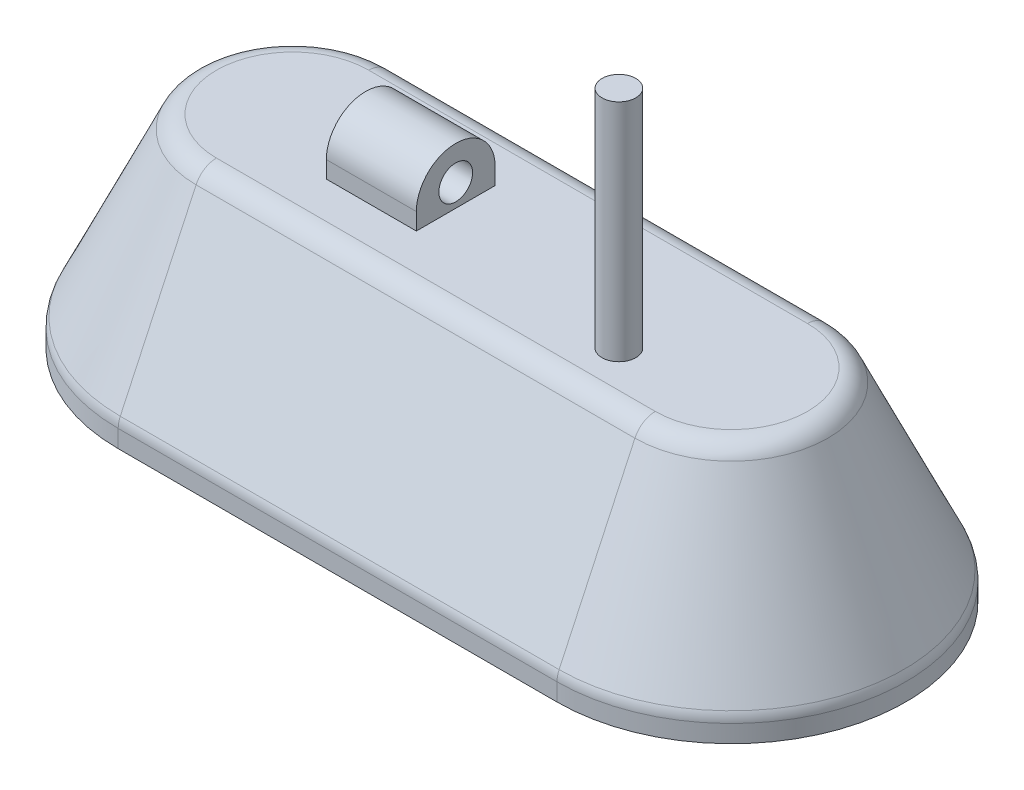
ISO-10303-21;
HEADER;
FILE_DESCRIPTION(('STEP AP214'),'2;1');
FILE_NAME('part.step','',(''),(''),'','','');
FILE_SCHEMA(('AUTOMOTIVE_DESIGN { 1 0 10303 214 1 1 1 1 }'));
ENDSEC;
DATA;
#1=APPLICATION_CONTEXT('core data for automotive mechanical design processes');
#2=APPLICATION_PROTOCOL_DEFINITION('international standard','automotive_design',2000,#1);
#3=PRODUCT_CONTEXT('',#1,'mechanical');
#4=PRODUCT('Part','Part','',(#3));
#5=PRODUCT_RELATED_PRODUCT_CATEGORY('part','',(#4));
#6=PRODUCT_DEFINITION_FORMATION('','',#4);
#7=PRODUCT_DEFINITION_CONTEXT('part definition',#1,'design');
#8=PRODUCT_DEFINITION('design','',#6,#7);
#9=PRODUCT_DEFINITION_SHAPE('','',#8);
#10=(LENGTH_UNIT() NAMED_UNIT(*) SI_UNIT(.MILLI.,.METRE.));
#11=(NAMED_UNIT(*) PLANE_ANGLE_UNIT() SI_UNIT($,.RADIAN.));
#12=(NAMED_UNIT(*) SI_UNIT($,.STERADIAN.) SOLID_ANGLE_UNIT());
#13=UNCERTAINTY_MEASURE_WITH_UNIT(LENGTH_MEASURE(1.E-05),#10,'distance_accuracy_value','');
#14=(GEOMETRIC_REPRESENTATION_CONTEXT(3) GLOBAL_UNCERTAINTY_ASSIGNED_CONTEXT((#13)) GLOBAL_UNIT_ASSIGNED_CONTEXT((#10,
#11,#12)) REPRESENTATION_CONTEXT('',''));
#15=CARTESIAN_POINT('',(0.,0.,0.));
#16=DIRECTION('',(0.,0.,1.));
#17=DIRECTION('',(1.,0.,0.));
#18=AXIS2_PLACEMENT_3D('',#15,#16,#17);
#19=CARTESIAN_POINT('',(-32.5,23.,-12.));
#20=DIRECTION('',(0.,0.,-1.));
#21=DIRECTION('',(-1.,0.,0.));
#22=AXIS2_PLACEMENT_3D('',#19,#20,#21);
#23=PLANE('',#22);
#24=DIRECTION('',(-1.,0.,0.));
#25=VECTOR('',#24,1.);
#26=CARTESIAN_POINT('',(-22.5,19.5,-12.));
#27=LINE('',#26,#25);
#28=CARTESIAN_POINT('',(-24.5,19.5,-12.));
#29=VERTEX_POINT('',#28);
#30=CARTESIAN_POINT('',(-32.5,19.5,-12.));
#31=VERTEX_POINT('',#30);
#32=EDGE_CURVE('E153',#29,#31,#27,.T.);
#33=ORIENTED_EDGE('',*,*,#32,.T.);
#34=DIRECTION('',(0.,-1.,0.));
#35=VECTOR('',#34,1.);
#36=CARTESIAN_POINT('',(-32.5,23.,-12.));
#37=LINE('',#36,#35);
#38=CARTESIAN_POINT('',(-32.5,18.,-12.));
#39=VERTEX_POINT('',#38);
#40=EDGE_CURVE('E165',#31,#39,#37,.T.);
#41=ORIENTED_EDGE('',*,*,#40,.T.);
#42=DIRECTION('',(1.,0.,0.));
#43=VECTOR('',#42,1.);
#44=CARTESIAN_POINT('',(-32.5,18.,-12.));
#45=LINE('',#44,#43);
#46=CARTESIAN_POINT('',(-24.5,18.,-12.));
#47=VERTEX_POINT('',#46);
#48=EDGE_CURVE('E606',#39,#47,#45,.T.);
#49=ORIENTED_EDGE('',*,*,#48,.T.);
#50=DIRECTION('',(0.,-1.,0.));
#51=VECTOR('',#50,1.);
#52=CARTESIAN_POINT('',(-24.5,23.,-12.));
#53=LINE('',#52,#51);
#54=EDGE_CURVE('E167',#29,#47,#53,.T.);
#55=ORIENTED_EDGE('',*,*,#54,.F.);
#56=EDGE_LOOP('',(#33,#41,#49,#55));
#57=FACE_BOUND('',#56,.T.);
#58=ADVANCED_FACE('F47',(#57),#23,.F.);
#59=CARTESIAN_POINT('',(0.,18.,-15.5));
#60=DIRECTION('',(0.,-1.,0.));
#61=DIRECTION('',(0.,0.,-1.));
#62=AXIS2_PLACEMENT_3D('',#59,#60,#61);
#63=PLANE('',#62);
#64=DIRECTION('',(-1.,0.,0.));
#65=VECTOR('',#64,1.);
#66=CARTESIAN_POINT('',(0.,18.,-8.73506305209498));
#67=LINE('',#66,#65);
#68=CARTESIAN_POINT('',(-39.,18.,-8.73506305209498));
#69=VERTEX_POINT('',#68);
#70=CARTESIAN_POINT('',(0.,18.,-8.73506305209498));
#71=VERTEX_POINT('',#70);
#72=EDGE_CURVE('E65',#69,#71,#67,.F.);
#73=ORIENTED_EDGE('',*,*,#72,.T.);
#74=CARTESIAN_POINT('',(0.,18.,-15.5));
#75=DIRECTION('',(0.,-1.,0.));
#76=DIRECTION('',(0.,0.,-1.));
#77=AXIS2_PLACEMENT_3D('',#74,#75,#76);
#78=CIRCLE('',#77,6.76493694790502);
#79=CARTESIAN_POINT('',(0.,18.,-22.264936947905));
#80=VERTEX_POINT('',#79);
#81=EDGE_CURVE('E276',#71,#80,#78,.F.);
#82=ORIENTED_EDGE('',*,*,#81,.T.);
#83=DIRECTION('',(1.,0.,0.));
#84=VECTOR('',#83,1.);
#85=CARTESIAN_POINT('',(-39.,18.,-22.264936947905));
#86=LINE('',#85,#84);
#87=CARTESIAN_POINT('',(-39.,18.,-22.264936947905));
#88=VERTEX_POINT('',#87);
#89=EDGE_CURVE('E269',#80,#88,#86,.F.);
#90=ORIENTED_EDGE('',*,*,#89,.T.);
#91=CARTESIAN_POINT('',(-39.,18.,-15.5));
#92=DIRECTION('',(0.,-1.,0.));
#93=DIRECTION('',(0.,0.,-1.));
#94=AXIS2_PLACEMENT_3D('',#91,#92,#93);
#95=CIRCLE('',#94,6.76493694790502);
#96=EDGE_CURVE('E70',#88,#69,#95,.F.);
#97=ORIENTED_EDGE('',*,*,#96,.T.);
#98=EDGE_LOOP('',(#73,#82,#90,#97));
#99=FACE_BOUND('',#98,.T.);
#100=CARTESIAN_POINT('',(-6.5,18.,-12.));
#101=DIRECTION('',(0.,-1.,0.));
#102=DIRECTION('',(0.,0.,-1.));
#103=AXIS2_PLACEMENT_3D('',#100,#101,#102);
#104=CIRCLE('',#103,1.5);
#105=CARTESIAN_POINT('',(-6.5,18.,-13.5));
#106=VERTEX_POINT('',#105);
#107=EDGE_CURVE('E213',#106,#106,#104,.F.);
#108=ORIENTED_EDGE('',*,*,#107,.F.);
#109=EDGE_LOOP('',(#108));
#110=FACE_BOUND('',#109,.T.);
#111=DIRECTION('',(0.,0.,1.));
#112=VECTOR('',#111,1.);
#113=CARTESIAN_POINT('',(-32.5,18.,-19.));
#114=LINE('',#113,#112);
#115=CARTESIAN_POINT('',(-32.5,18.,-19.));
#116=VERTEX_POINT('',#115);
#117=EDGE_CURVE('E173',#116,#39,#114,.T.);
#118=ORIENTED_EDGE('',*,*,#117,.F.);
#119=DIRECTION('',(-1.,0.,0.));
#120=VECTOR('',#119,1.);
#121=CARTESIAN_POINT('',(-24.5,18.,-19.));
#122=LINE('',#121,#120);
#123=CARTESIAN_POINT('',(-24.5,18.,-19.));
#124=VERTEX_POINT('',#123);
#125=EDGE_CURVE('E599',#124,#116,#122,.T.);
#126=ORIENTED_EDGE('',*,*,#125,.F.);
#127=DIRECTION('',(0.,0.,-1.));
#128=VECTOR('',#127,1.);
#129=CARTESIAN_POINT('',(-24.5,18.,-12.));
#130=LINE('',#129,#128);
#131=EDGE_CURVE('E593',#47,#124,#130,.T.);
#132=ORIENTED_EDGE('',*,*,#131,.F.);
#133=ORIENTED_EDGE('',*,*,#48,.F.);
#134=EDGE_LOOP('',(#118,#126,#132,#133));
#135=FACE_BOUND('',#134,.T.);
#136=ADVANCED_FACE('F374',(#99,#110,#135),#63,.F.);
#137=CARTESIAN_POINT('',(0.,18.,-15.5));
#138=DIRECTION('',(0.,-1.,0.));
#139=DIRECTION('',(0.,0.,-1.));
#140=AXIS2_PLACEMENT_3D('',#137,#138,#139);
#141=CYLINDRICAL_SURFACE('',#140,15.5);
#142=DIRECTION('',(0.,-1.,0.));
#143=VECTOR('',#142,1.);
#144=CARTESIAN_POINT('',(0.,18.,-31.));
#145=LINE('',#144,#143);
#146=CARTESIAN_POINT('',(0.,1.55661067471401,-31.));
#147=VERTEX_POINT('',#146);
#148=CARTESIAN_POINT('',(0.,0.,-31.));
#149=VERTEX_POINT('',#148);
#150=EDGE_CURVE('E210',#147,#149,#145,.T.);
#151=ORIENTED_EDGE('',*,*,#150,.F.);
#152=CARTESIAN_POINT('',(0.,1.55661067471401,-15.5));
#153=DIRECTION('',(0.,1.,0.));
#154=DIRECTION('',(0.,0.,1.));
#155=AXIS2_PLACEMENT_3D('',#152,#153,#154);
#156=CIRCLE('',#155,15.5);
#157=CARTESIAN_POINT('',(0.,1.55661067471401,0.));
#158=VERTEX_POINT('',#157);
#159=EDGE_CURVE('E259',#147,#158,#156,.F.);
#160=ORIENTED_EDGE('',*,*,#159,.T.);
#161=DIRECTION('',(0.,-1.,0.));
#162=VECTOR('',#161,1.);
#163=CARTESIAN_POINT('',(0.,18.,0.));
#164=LINE('',#163,#162);
#165=CARTESIAN_POINT('',(0.,0.,0.));
#166=VERTEX_POINT('',#165);
#167=EDGE_CURVE('E201',#158,#166,#164,.T.);
#168=ORIENTED_EDGE('',*,*,#167,.T.);
#169=CARTESIAN_POINT('',(0.,0.,-15.5));
#170=DIRECTION('',(0.,1.,0.));
#171=DIRECTION('',(0.,0.,-1.));
#172=AXIS2_PLACEMENT_3D('',#169,#170,#171);
#173=CIRCLE('',#172,15.5);
#174=EDGE_CURVE('E180',#166,#149,#173,.T.);
#175=ORIENTED_EDGE('',*,*,#174,.T.);
#176=EDGE_LOOP('',(#151,#160,#168,#175));
#177=FACE_BOUND('',#176,.T.);
#178=ADVANCED_FACE('F364',(#177),#141,.T.);
#179=CARTESIAN_POINT('',(-39.,18.,-31.));
#180=DIRECTION('',(0.,0.,1.));
#181=DIRECTION('',(1.,0.,0.));
#182=AXIS2_PLACEMENT_3D('',#179,#180,#181);
#183=PLANE('',#182);
#184=DIRECTION('',(0.,-1.,0.));
#185=VECTOR('',#184,1.);
#186=CARTESIAN_POINT('',(-39.,18.,-31.));
#187=LINE('',#186,#185);
#188=CARTESIAN_POINT('',(-39.,1.55661067471401,-31.));
#189=VERTEX_POINT('',#188);
#190=CARTESIAN_POINT('',(-39.,0.,-31.));
#191=VERTEX_POINT('',#190);
#192=EDGE_CURVE('E207',#189,#191,#187,.T.);
#193=ORIENTED_EDGE('',*,*,#192,.F.);
#194=DIRECTION('',(-1.,0.,0.));
#195=VECTOR('',#194,1.);
#196=CARTESIAN_POINT('',(0.,1.55661067471401,-31.));
#197=LINE('',#196,#195);
#198=EDGE_CURVE('E279',#189,#147,#197,.F.);
#199=ORIENTED_EDGE('',*,*,#198,.T.);
#200=ORIENTED_EDGE('',*,*,#150,.T.);
#201=DIRECTION('',(-1.,0.,0.));
#202=VECTOR('',#201,1.);
#203=CARTESIAN_POINT('',(-39.,0.,-31.));
#204=LINE('',#203,#202);
#205=EDGE_CURVE('E189',#149,#191,#204,.T.);
#206=ORIENTED_EDGE('',*,*,#205,.T.);
#207=EDGE_LOOP('',(#193,#199,#200,#206));
#208=FACE_BOUND('',#207,.T.);
#209=ADVANCED_FACE('F366',(#208),#183,.F.);
#210=CARTESIAN_POINT('',(-39.,18.,-15.5));
#211=DIRECTION('',(0.,-1.,0.));
#212=DIRECTION('',(0.,0.,-1.));
#213=AXIS2_PLACEMENT_3D('',#210,#211,#212);
#214=CYLINDRICAL_SURFACE('',#213,15.5);
#215=DIRECTION('',(0.,-1.,0.));
#216=VECTOR('',#215,1.);
#217=CARTESIAN_POINT('',(-39.,18.,0.));
#218=LINE('',#217,#216);
#219=CARTESIAN_POINT('',(-39.,1.55661067471401,0.));
#220=VERTEX_POINT('',#219);
#221=CARTESIAN_POINT('',(-39.,0.,0.));
#222=VERTEX_POINT('',#221);
#223=EDGE_CURVE('E204',#220,#222,#218,.T.);
#224=ORIENTED_EDGE('',*,*,#223,.F.);
#225=CARTESIAN_POINT('',(-39.,1.55661067471401,-15.5));
#226=DIRECTION('',(0.,1.,0.));
#227=DIRECTION('',(0.,0.,1.));
#228=AXIS2_PLACEMENT_3D('',#225,#226,#227);
#229=CIRCLE('',#228,15.5);
#230=EDGE_CURVE('E217',#220,#189,#229,.F.);
#231=ORIENTED_EDGE('',*,*,#230,.T.);
#232=ORIENTED_EDGE('',*,*,#192,.T.);
#233=CARTESIAN_POINT('',(-39.,0.,-15.5));
#234=DIRECTION('',(0.,1.,0.));
#235=DIRECTION('',(0.,0.,1.));
#236=AXIS2_PLACEMENT_3D('',#233,#234,#235);
#237=CIRCLE('',#236,15.5);
#238=EDGE_CURVE('E193',#191,#222,#237,.T.);
#239=ORIENTED_EDGE('',*,*,#238,.T.);
#240=EDGE_LOOP('',(#224,#231,#232,#239));
#241=FACE_BOUND('',#240,.T.);
#242=ADVANCED_FACE('F354',(#241),#214,.T.);
#243=CARTESIAN_POINT('',(0.,18.,0.));
#244=DIRECTION('',(0.,0.,-1.));
#245=DIRECTION('',(-1.,0.,0.));
#246=AXIS2_PLACEMENT_3D('',#243,#244,#245);
#247=PLANE('',#246);
#248=ORIENTED_EDGE('',*,*,#167,.F.);
#249=DIRECTION('',(1.,0.,0.));
#250=VECTOR('',#249,1.);
#251=CARTESIAN_POINT('',(-39.,1.55661067471401,0.));
#252=LINE('',#251,#250);
#253=EDGE_CURVE('E250',#158,#220,#252,.F.);
#254=ORIENTED_EDGE('',*,*,#253,.T.);
#255=ORIENTED_EDGE('',*,*,#223,.T.);
#256=DIRECTION('',(1.,0.,0.));
#257=VECTOR('',#256,1.);
#258=CARTESIAN_POINT('',(0.,0.,0.));
#259=LINE('',#258,#257);
#260=EDGE_CURVE('E197',#222,#166,#259,.T.);
#261=ORIENTED_EDGE('',*,*,#260,.T.);
#262=EDGE_LOOP('',(#248,#254,#255,#261));
#263=FACE_BOUND('',#262,.T.);
#264=ADVANCED_FACE('F352',(#263),#247,.F.);
#265=CARTESIAN_POINT('',(0.,0.,-15.5));
#266=DIRECTION('',(0.,-1.,0.));
#267=DIRECTION('',(0.,0.,-1.));
#268=AXIS2_PLACEMENT_3D('',#265,#266,#267);
#269=PLANE('',#268);
#270=ORIENTED_EDGE('',*,*,#174,.F.);
#271=ORIENTED_EDGE('',*,*,#260,.F.);
#272=ORIENTED_EDGE('',*,*,#238,.F.);
#273=ORIENTED_EDGE('',*,*,#205,.F.);
#274=EDGE_LOOP('',(#270,#271,#272,#273));
#275=FACE_BOUND('',#274,.T.);
#276=ADVANCED_FACE('F361',(#275),#269,.T.);
#277=CARTESIAN_POINT('',(-6.5,38.,-12.));
#278=DIRECTION('',(0.,-1.,0.));
#279=DIRECTION('',(0.,0.,-1.));
#280=AXIS2_PLACEMENT_3D('',#277,#278,#279);
#281=CYLINDRICAL_SURFACE('',#280,1.5);
#282=CARTESIAN_POINT('',(-6.5,38.,-12.));
#283=DIRECTION('',(0.,1.,0.));
#284=DIRECTION('',(0.,0.,1.));
#285=AXIS2_PLACEMENT_3D('',#282,#283,#284);
#286=CIRCLE('',#285,1.5);
#287=CARTESIAN_POINT('',(-6.5,38.,-10.5));
#288=VERTEX_POINT('',#287);
#289=EDGE_CURVE('E175',#288,#288,#286,.T.);
#290=ORIENTED_EDGE('',*,*,#289,.F.);
#291=EDGE_LOOP('',(#290));
#292=FACE_BOUND('',#291,.T.);
#293=ORIENTED_EDGE('',*,*,#107,.T.);
#294=EDGE_LOOP('',(#293));
#295=FACE_BOUND('',#294,.T.);
#296=ADVANCED_FACE('F392',(#292,#295),#281,.T.);
#297=CARTESIAN_POINT('',(-6.5,38.,-12.));
#298=DIRECTION('',(0.,1.,0.));
#299=DIRECTION('',(0.,0.,1.));
#300=AXIS2_PLACEMENT_3D('',#297,#298,#299);
#301=PLANE('',#300);
#302=ORIENTED_EDGE('',*,*,#289,.T.);
#303=EDGE_LOOP('',(#302));
#304=FACE_BOUND('',#303,.T.);
#305=ADVANCED_FACE('F389',(#304),#301,.T.);
#306=CARTESIAN_POINT('',(-32.5,23.,-19.));
#307=DIRECTION('',(1.,0.,0.));
#308=DIRECTION('',(0.,0.,-1.));
#309=AXIS2_PLACEMENT_3D('',#306,#307,#308);
#310=PLANE('',#309);
#311=CARTESIAN_POINT('',(-32.5,20.,-15.5));
#312=DIRECTION('',(-1.,0.,0.));
#313=DIRECTION('',(0.,0.,1.));
#314=AXIS2_PLACEMENT_3D('',#311,#312,#313);
#315=CIRCLE('',#314,1.5);
#316=CARTESIAN_POINT('',(-32.5,20.,-14.));
#317=VERTEX_POINT('',#316);
#318=EDGE_CURVE('E161',#317,#317,#315,.T.);
#319=ORIENTED_EDGE('',*,*,#318,.F.);
#320=EDGE_LOOP('',(#319));
#321=FACE_BOUND('',#320,.T.);
#322=ORIENTED_EDGE('',*,*,#40,.F.);
#323=CARTESIAN_POINT('',(-32.5,19.5,-15.5));
#324=DIRECTION('',(1.,0.,0.));
#325=DIRECTION('',(0.,0.,-1.));
#326=AXIS2_PLACEMENT_3D('',#323,#324,#325);
#327=CIRCLE('',#326,3.50000000000001);
#328=CARTESIAN_POINT('',(-32.5,19.5,-19.));
#329=VERTEX_POINT('',#328);
#330=EDGE_CURVE('E150',#329,#31,#327,.T.);
#331=ORIENTED_EDGE('',*,*,#330,.F.);
#332=DIRECTION('',(0.,-1.,0.));
#333=VECTOR('',#332,1.);
#334=CARTESIAN_POINT('',(-32.5,23.,-19.));
#335=LINE('',#334,#333);
#336=EDGE_CURVE('E597',#329,#116,#335,.T.);
#337=ORIENTED_EDGE('',*,*,#336,.T.);
#338=ORIENTED_EDGE('',*,*,#117,.T.);
#339=EDGE_LOOP('',(#322,#331,#337,#338));
#340=FACE_BOUND('',#339,.T.);
#341=ADVANCED_FACE('F171',(#321,#340),#310,.F.);
#342=CARTESIAN_POINT('',(-24.5,23.,-12.));
#343=DIRECTION('',(-1.,0.,0.));
#344=DIRECTION('',(0.,0.,1.));
#345=AXIS2_PLACEMENT_3D('',#342,#343,#344);
#346=PLANE('',#345);
#347=CARTESIAN_POINT('',(-24.5,20.,-15.5));
#348=DIRECTION('',(-1.,0.,0.));
#349=DIRECTION('',(0.,0.,1.));
#350=AXIS2_PLACEMENT_3D('',#347,#348,#349);
#351=CIRCLE('',#350,1.5);
#352=CARTESIAN_POINT('',(-24.5,20.,-14.));
#353=VERTEX_POINT('',#352);
#354=EDGE_CURVE('E218',#353,#353,#351,.T.);
#355=ORIENTED_EDGE('',*,*,#354,.T.);
#356=EDGE_LOOP('',(#355));
#357=FACE_BOUND('',#356,.T.);
#358=DIRECTION('',(0.,-1.,0.));
#359=VECTOR('',#358,1.);
#360=CARTESIAN_POINT('',(-24.5,23.,-19.));
#361=LINE('',#360,#359);
#362=CARTESIAN_POINT('',(-24.5,19.5,-19.));
#363=VERTEX_POINT('',#362);
#364=EDGE_CURVE('E182',#363,#124,#361,.T.);
#365=ORIENTED_EDGE('',*,*,#364,.F.);
#366=CARTESIAN_POINT('',(-24.5,19.5,-15.5));
#367=DIRECTION('',(-1.,0.,0.));
#368=DIRECTION('',(0.,0.,1.));
#369=AXIS2_PLACEMENT_3D('',#366,#367,#368);
#370=CIRCLE('',#369,3.50000000000001);
#371=EDGE_CURVE('E222',#363,#29,#370,.F.);
#372=ORIENTED_EDGE('',*,*,#371,.T.);
#373=ORIENTED_EDGE('',*,*,#54,.T.);
#374=ORIENTED_EDGE('',*,*,#131,.T.);
#375=EDGE_LOOP('',(#365,#372,#373,#374));
#376=FACE_BOUND('',#375,.T.);
#377=ADVANCED_FACE('F386',(#357,#376),#346,.F.);
#378=CARTESIAN_POINT('',(-24.5,23.,-19.));
#379=DIRECTION('',(0.,0.,1.));
#380=DIRECTION('',(1.,0.,0.));
#381=AXIS2_PLACEMENT_3D('',#378,#379,#380);
#382=PLANE('',#381);
#383=ORIENTED_EDGE('',*,*,#336,.F.);
#384=DIRECTION('',(-1.,0.,0.));
#385=VECTOR('',#384,1.);
#386=CARTESIAN_POINT('',(-22.5,19.5,-19.));
#387=LINE('',#386,#385);
#388=EDGE_CURVE('E156',#363,#329,#387,.T.);
#389=ORIENTED_EDGE('',*,*,#388,.F.);
#390=ORIENTED_EDGE('',*,*,#364,.T.);
#391=ORIENTED_EDGE('',*,*,#125,.T.);
#392=EDGE_LOOP('',(#383,#389,#390,#391));
#393=FACE_BOUND('',#392,.T.);
#394=ADVANCED_FACE('F518',(#393),#382,.F.);
#395=CARTESIAN_POINT('',(-22.5,19.5,-15.5));
#396=DIRECTION('',(-1.,0.,0.));
#397=DIRECTION('',(0.,0.,1.));
#398=AXIS2_PLACEMENT_3D('',#395,#396,#397);
#399=CYLINDRICAL_SURFACE('',#398,3.50000000000001);
#400=ORIENTED_EDGE('',*,*,#388,.T.);
#401=ORIENTED_EDGE('',*,*,#330,.T.);
#402=ORIENTED_EDGE('',*,*,#32,.F.);
#403=ORIENTED_EDGE('',*,*,#371,.F.);
#404=EDGE_LOOP('',(#400,#401,#402,#403));
#405=FACE_BOUND('',#404,.T.);
#406=ADVANCED_FACE('F152',(#405),#399,.T.);
#407=CARTESIAN_POINT('',(-22.5,20.,-15.5));
#408=DIRECTION('',(-1.,0.,0.));
#409=DIRECTION('',(0.,0.,1.));
#410=AXIS2_PLACEMENT_3D('',#407,#408,#409);
#411=CYLINDRICAL_SURFACE('',#410,1.5);
#412=ORIENTED_EDGE('',*,*,#318,.T.);
#413=EDGE_LOOP('',(#412));
#414=FACE_BOUND('',#413,.T.);
#415=ORIENTED_EDGE('',*,*,#354,.F.);
#416=EDGE_LOOP('',(#415));
#417=FACE_BOUND('',#416,.T.);
#418=ADVANCED_FACE('F412',(#414,#417),#411,.F.);
#419=CARTESIAN_POINT('',(0.,18.,-23.53907746952));
#420=DIRECTION('',(0.,-0.422618261740697,0.906307787036651));
#421=DIRECTION('',(-1.,0.,0.));
#422=AXIS2_PLACEMENT_3D('',#419,#420,#421);
#423=PLANE('',#422);
#424=DIRECTION('',(0.,0.906307787036651,0.422618261740697));
#425=VECTOR('',#424,1.);
#426=CARTESIAN_POINT('',(0.,1.99999999999989,-31.));
#427=LINE('',#426,#425);
#428=CARTESIAN_POINT('',(0.,2.40184719819541,-30.8126155740733));
#429=VERTEX_POINT('',#428);
#430=CARTESIAN_POINT('',(0.,16.8452365234814,-24.0775525219783));
#431=VERTEX_POINT('',#430);
#432=EDGE_CURVE('E232',#429,#431,#427,.T.);
#433=ORIENTED_EDGE('',*,*,#432,.F.);
#434=DIRECTION('',(1.,0.,0.));
#435=VECTOR('',#434,1.);
#436=CARTESIAN_POINT('',(-39.,2.40184719819541,-30.8126155740733));
#437=LINE('',#436,#435);
#438=CARTESIAN_POINT('',(-39.,2.40184719819541,-30.8126155740733));
#439=VERTEX_POINT('',#438);
#440=EDGE_CURVE('E11',#429,#439,#437,.F.);
#441=ORIENTED_EDGE('',*,*,#440,.T.);
#442=DIRECTION('',(0.,-0.906307787036651,-0.422618261740697));
#443=VECTOR('',#442,1.);
#444=CARTESIAN_POINT('',(-39.,18.,-23.53907746952));
#445=LINE('',#444,#443);
#446=CARTESIAN_POINT('',(-39.,16.8452365234814,-24.0775525219783));
#447=VERTEX_POINT('',#446);
#448=EDGE_CURVE('E236',#447,#439,#445,.T.);
#449=ORIENTED_EDGE('',*,*,#448,.F.);
#450=DIRECTION('',(-1.,0.,0.));
#451=VECTOR('',#450,1.);
#452=CARTESIAN_POINT('',(0.,16.8452365234814,-24.0775525219783));
#453=LINE('',#452,#451);
#454=EDGE_CURVE('E57',#447,#431,#453,.F.);
#455=ORIENTED_EDGE('',*,*,#454,.T.);
#456=EDGE_LOOP('',(#433,#441,#449,#455));
#457=FACE_BOUND('',#456,.T.);
#458=ADVANCED_FACE('F323',(#457),#423,.F.);
#459=CARTESIAN_POINT('',(-39.,18.,-15.5));
#460=DIRECTION('',(0.,-1.,0.));
#461=DIRECTION('',(0.,0.,-1.));
#462=AXIS2_PLACEMENT_3D('',#459,#460,#461);
#463=CONICAL_SURFACE('',#462,8.03907746952001,0.43633231299858);
#464=ORIENTED_EDGE('',*,*,#448,.T.);
#465=CARTESIAN_POINT('',(-39.,2.40184719819541,-15.5));
#466=DIRECTION('',(0.,-1.,0.));
#467=DIRECTION('',(0.,0.,-1.));
#468=AXIS2_PLACEMENT_3D('',#465,#466,#467);
#469=CIRCLE('',#468,15.3126155740733);
#470=CARTESIAN_POINT('',(-39.,2.40184719819541,-0.187384425926702));
#471=VERTEX_POINT('',#470);
#472=EDGE_CURVE('E246',#439,#471,#469,.F.);
#473=ORIENTED_EDGE('',*,*,#472,.T.);
#474=DIRECTION('',(0.,-0.906307787036651,0.422618261740697));
#475=VECTOR('',#474,1.);
#476=CARTESIAN_POINT('',(-39.,18.,-7.46092253047999));
#477=LINE('',#476,#475);
#478=CARTESIAN_POINT('',(-39.,16.8452365234814,-6.92244747802168));
#479=VERTEX_POINT('',#478);
#480=EDGE_CURVE('E227',#479,#471,#477,.T.);
#481=ORIENTED_EDGE('',*,*,#480,.F.);
#482=CARTESIAN_POINT('',(-39.,16.8452365234814,-15.5));
#483=DIRECTION('',(0.,-1.,0.));
#484=DIRECTION('',(0.,0.,-1.));
#485=AXIS2_PLACEMENT_3D('',#482,#483,#484);
#486=CIRCLE('',#485,8.57755252197832);
#487=EDGE_CURVE('E243',#479,#447,#486,.T.);
#488=ORIENTED_EDGE('',*,*,#487,.T.);
#489=EDGE_LOOP('',(#464,#473,#481,#488));
#490=FACE_BOUND('',#489,.T.);
#491=ADVANCED_FACE('F319',(#490),#463,.T.);
#492=CARTESIAN_POINT('',(0.,18.,-15.5));
#493=DIRECTION('',(0.,-1.,0.));
#494=DIRECTION('',(0.,0.,-1.));
#495=AXIS2_PLACEMENT_3D('',#492,#493,#494);
#496=CONICAL_SURFACE('',#495,8.03907746952001,0.43633231299858);
#497=DIRECTION('',(0.,0.906307787036651,-0.422618261740697));
#498=VECTOR('',#497,1.);
#499=CARTESIAN_POINT('',(0.,1.99999999999989,0.));
#500=LINE('',#499,#498);
#501=CARTESIAN_POINT('',(0.,2.40184719819541,-0.187384425926699));
#502=VERTEX_POINT('',#501);
#503=CARTESIAN_POINT('',(0.,16.8452365234814,-6.92244747802168));
#504=VERTEX_POINT('',#503);
#505=EDGE_CURVE('E223',#502,#504,#500,.T.);
#506=ORIENTED_EDGE('',*,*,#505,.F.);
#507=CARTESIAN_POINT('',(0.,2.40184719819541,-15.5));
#508=DIRECTION('',(0.,-1.,0.));
#509=DIRECTION('',(0.,0.,-1.));
#510=AXIS2_PLACEMENT_3D('',#507,#508,#509);
#511=CIRCLE('',#510,15.3126155740733);
#512=EDGE_CURVE('E266',#502,#429,#511,.F.);
#513=ORIENTED_EDGE('',*,*,#512,.T.);
#514=ORIENTED_EDGE('',*,*,#432,.T.);
#515=CARTESIAN_POINT('',(0.,16.8452365234814,-15.5));
#516=DIRECTION('',(0.,-1.,0.));
#517=DIRECTION('',(0.,0.,-1.));
#518=AXIS2_PLACEMENT_3D('',#515,#516,#517);
#519=CIRCLE('',#518,8.57755252197832);
#520=EDGE_CURVE('E262',#431,#504,#519,.T.);
#521=ORIENTED_EDGE('',*,*,#520,.T.);
#522=EDGE_LOOP('',(#506,#513,#514,#521));
#523=FACE_BOUND('',#522,.T.);
#524=ADVANCED_FACE('F340',(#523),#496,.T.);
#525=CARTESIAN_POINT('',(0.,18.,-7.46092253047999));
#526=DIRECTION('',(0.,-0.422618261740697,-0.906307787036651));
#527=DIRECTION('',(1.,0.,0.));
#528=AXIS2_PLACEMENT_3D('',#525,#526,#527);
#529=PLANE('',#528);
#530=ORIENTED_EDGE('',*,*,#480,.T.);
#531=DIRECTION('',(-1.,0.,0.));
#532=VECTOR('',#531,1.);
#533=CARTESIAN_POINT('',(0.,2.40184719819541,-0.187384425926698));
#534=LINE('',#533,#532);
#535=EDGE_CURVE('E256',#471,#502,#534,.F.);
#536=ORIENTED_EDGE('',*,*,#535,.T.);
#537=ORIENTED_EDGE('',*,*,#505,.T.);
#538=DIRECTION('',(1.,0.,0.));
#539=VECTOR('',#538,1.);
#540=CARTESIAN_POINT('',(-39.,16.8452365234814,-6.92244747802168));
#541=LINE('',#540,#539);
#542=EDGE_CURVE('E253',#504,#479,#541,.F.);
#543=ORIENTED_EDGE('',*,*,#542,.T.);
#544=EDGE_LOOP('',(#530,#536,#537,#543));
#545=FACE_BOUND('',#544,.T.);
#546=ADVANCED_FACE('F336',(#545),#529,.F.);
#547=CARTESIAN_POINT('',(0.,1.55661067471401,-15.5));
#548=DIRECTION('',(0.,1.,0.));
#549=DIRECTION('',(0.,0.,1.));
#550=AXIS2_PLACEMENT_3D('',#547,#548,#549);
#551=TOROIDAL_SURFACE('',#550,13.5,2.);
#552=CARTESIAN_POINT('',(0.,1.55661067471401,-29.));
#553=DIRECTION('',(-1.,0.,0.));
#554=DIRECTION('',(0.,0.,1.));
#555=AXIS2_PLACEMENT_3D('',#552,#553,#554);
#556=CIRCLE('',#555,2.);
#557=EDGE_CURVE('E290',#429,#147,#556,.T.);
#558=ORIENTED_EDGE('',*,*,#557,.F.);
#559=ORIENTED_EDGE('',*,*,#512,.F.);
#560=CARTESIAN_POINT('',(0.,1.55661067471401,-2.));
#561=DIRECTION('',(-1.,0.,0.));
#562=DIRECTION('',(0.,0.,1.));
#563=AXIS2_PLACEMENT_3D('',#560,#561,#562);
#564=CIRCLE('',#563,2.);
#565=EDGE_CURVE('E228',#158,#502,#564,.T.);
#566=ORIENTED_EDGE('',*,*,#565,.F.);
#567=ORIENTED_EDGE('',*,*,#159,.F.);
#568=EDGE_LOOP('',(#558,#559,#566,#567));
#569=FACE_BOUND('',#568,.T.);
#570=ADVANCED_FACE('F344',(#569),#551,.T.);
#571=CARTESIAN_POINT('',(0.,1.55661067471401,-2.));
#572=DIRECTION('',(-1.,0.,0.));
#573=DIRECTION('',(0.,0.,1.));
#574=AXIS2_PLACEMENT_3D('',#571,#572,#573);
#575=CYLINDRICAL_SURFACE('',#574,2.);
#576=ORIENTED_EDGE('',*,*,#565,.T.);
#577=ORIENTED_EDGE('',*,*,#535,.F.);
#578=CARTESIAN_POINT('',(-39.,1.55661067471401,-2.));
#579=DIRECTION('',(-1.,0.,0.));
#580=DIRECTION('',(0.,0.,1.));
#581=AXIS2_PLACEMENT_3D('',#578,#579,#580);
#582=CIRCLE('',#581,2.);
#583=EDGE_CURVE('E287',#220,#471,#582,.T.);
#584=ORIENTED_EDGE('',*,*,#583,.F.);
#585=ORIENTED_EDGE('',*,*,#253,.F.);
#586=EDGE_LOOP('',(#576,#577,#584,#585));
#587=FACE_BOUND('',#586,.T.);
#588=ADVANCED_FACE('F348',(#587),#575,.T.);
#589=CARTESIAN_POINT('',(-39.,1.55661067471401,-29.));
#590=DIRECTION('',(1.,0.,0.));
#591=DIRECTION('',(0.,0.,-1.));
#592=AXIS2_PLACEMENT_3D('',#589,#590,#591);
#593=CYLINDRICAL_SURFACE('',#592,2.);
#594=ORIENTED_EDGE('',*,*,#557,.T.);
#595=ORIENTED_EDGE('',*,*,#198,.F.);
#596=CARTESIAN_POINT('',(-39.,1.55661067471401,-29.));
#597=DIRECTION('',(-1.,0.,0.));
#598=DIRECTION('',(0.,0.,1.));
#599=AXIS2_PLACEMENT_3D('',#596,#597,#598);
#600=CIRCLE('',#599,2.);
#601=EDGE_CURVE('E284',#439,#189,#600,.T.);
#602=ORIENTED_EDGE('',*,*,#601,.F.);
#603=ORIENTED_EDGE('',*,*,#440,.F.);
#604=EDGE_LOOP('',(#594,#595,#602,#603));
#605=FACE_BOUND('',#604,.T.);
#606=ADVANCED_FACE('F328',(#605),#593,.T.);
#607=CARTESIAN_POINT('',(-39.,1.55661067471401,-15.5));
#608=DIRECTION('',(0.,1.,0.));
#609=DIRECTION('',(0.,0.,1.));
#610=AXIS2_PLACEMENT_3D('',#607,#608,#609);
#611=TOROIDAL_SURFACE('',#610,13.5,2.);
#612=ORIENTED_EDGE('',*,*,#583,.T.);
#613=ORIENTED_EDGE('',*,*,#472,.F.);
#614=ORIENTED_EDGE('',*,*,#601,.T.);
#615=ORIENTED_EDGE('',*,*,#230,.F.);
#616=EDGE_LOOP('',(#612,#613,#614,#615));
#617=FACE_BOUND('',#616,.T.);
#618=ADVANCED_FACE('F332',(#617),#611,.T.);
#619=CARTESIAN_POINT('',(-39.,16.,-15.5));
#620=DIRECTION('',(0.,-1.,0.));
#621=DIRECTION('',(0.,0.,-1.));
#622=AXIS2_PLACEMENT_3D('',#619,#620,#621);
#623=TOROIDAL_SURFACE('',#622,6.76493694790502,2.);
#624=CARTESIAN_POINT('',(-39.,16.,-22.264936947905));
#625=DIRECTION('',(1.,0.,0.));
#626=DIRECTION('',(0.,0.,-1.));
#627=AXIS2_PLACEMENT_3D('',#624,#625,#626);
#628=CIRCLE('',#627,2.);
#629=EDGE_CURVE('E302',#447,#88,#628,.T.);
#630=ORIENTED_EDGE('',*,*,#629,.F.);
#631=ORIENTED_EDGE('',*,*,#487,.F.);
#632=CARTESIAN_POINT('',(-39.,16.,-8.73506305209498));
#633=DIRECTION('',(1.,0.,0.));
#634=DIRECTION('',(0.,0.,-1.));
#635=AXIS2_PLACEMENT_3D('',#632,#633,#634);
#636=CIRCLE('',#635,2.);
#637=EDGE_CURVE('E51',#69,#479,#636,.T.);
#638=ORIENTED_EDGE('',*,*,#637,.F.);
#639=ORIENTED_EDGE('',*,*,#96,.F.);
#640=EDGE_LOOP('',(#630,#631,#638,#639));
#641=FACE_BOUND('',#640,.T.);
#642=ADVANCED_FACE('F49',(#641),#623,.T.);
#643=CARTESIAN_POINT('',(0.,16.,-8.73506305209498));
#644=DIRECTION('',(1.,0.,0.));
#645=DIRECTION('',(0.,0.,-1.));
#646=AXIS2_PLACEMENT_3D('',#643,#644,#645);
#647=CYLINDRICAL_SURFACE('',#646,2.);
#648=ORIENTED_EDGE('',*,*,#637,.T.);
#649=ORIENTED_EDGE('',*,*,#542,.F.);
#650=CARTESIAN_POINT('',(0.,16.,-8.73506305209498));
#651=DIRECTION('',(1.,0.,0.));
#652=DIRECTION('',(0.,0.,-1.));
#653=AXIS2_PLACEMENT_3D('',#650,#651,#652);
#654=CIRCLE('',#653,2.);
#655=EDGE_CURVE('E300',#71,#504,#654,.T.);
#656=ORIENTED_EDGE('',*,*,#655,.F.);
#657=ORIENTED_EDGE('',*,*,#72,.F.);
#658=EDGE_LOOP('',(#648,#649,#656,#657));
#659=FACE_BOUND('',#658,.T.);
#660=ADVANCED_FACE('F313',(#659),#647,.T.);
#661=CARTESIAN_POINT('',(0.,16.,-22.264936947905));
#662=DIRECTION('',(-1.,0.,0.));
#663=DIRECTION('',(0.,0.,1.));
#664=AXIS2_PLACEMENT_3D('',#661,#662,#663);
#665=CYLINDRICAL_SURFACE('',#664,2.);
#666=ORIENTED_EDGE('',*,*,#629,.T.);
#667=ORIENTED_EDGE('',*,*,#89,.F.);
#668=CARTESIAN_POINT('',(0.,16.,-22.264936947905));
#669=DIRECTION('',(1.,0.,0.));
#670=DIRECTION('',(0.,1.,0.));
#671=AXIS2_PLACEMENT_3D('',#668,#669,#670);
#672=CIRCLE('',#671,2.);
#673=EDGE_CURVE('E297',#431,#80,#672,.T.);
#674=ORIENTED_EDGE('',*,*,#673,.F.);
#675=ORIENTED_EDGE('',*,*,#454,.F.);
#676=EDGE_LOOP('',(#666,#667,#674,#675));
#677=FACE_BOUND('',#676,.T.);
#678=ADVANCED_FACE('F476',(#677),#665,.T.);
#679=CARTESIAN_POINT('',(0.,16.,-15.5));
#680=DIRECTION('',(0.,-1.,0.));
#681=DIRECTION('',(0.,0.,-1.));
#682=AXIS2_PLACEMENT_3D('',#679,#680,#681);
#683=TOROIDAL_SURFACE('',#682,6.76493694790502,2.);
#684=ORIENTED_EDGE('',*,*,#655,.T.);
#685=ORIENTED_EDGE('',*,*,#520,.F.);
#686=ORIENTED_EDGE('',*,*,#673,.T.);
#687=ORIENTED_EDGE('',*,*,#81,.F.);
#688=EDGE_LOOP('',(#684,#685,#686,#687));
#689=FACE_BOUND('',#688,.T.);
#690=ADVANCED_FACE('F483',(#689),#683,.T.);
#691=CLOSED_SHELL('',(#58,#136,#178,#209,#242,#264,#276,#296,#305,#341,#377,#394,#406,#418,#458,
#491,#524,#546,#570,#588,#606,#618,#642,#660,#678,#690));
#692=MANIFOLD_SOLID_BREP('B2',#691);
#693=ADVANCED_BREP_SHAPE_REPRESENTATION('',(#18,#692),#14);
#694=SHAPE_DEFINITION_REPRESENTATION(#9,#693);
ENDSEC;
END-ISO-10303-21;
